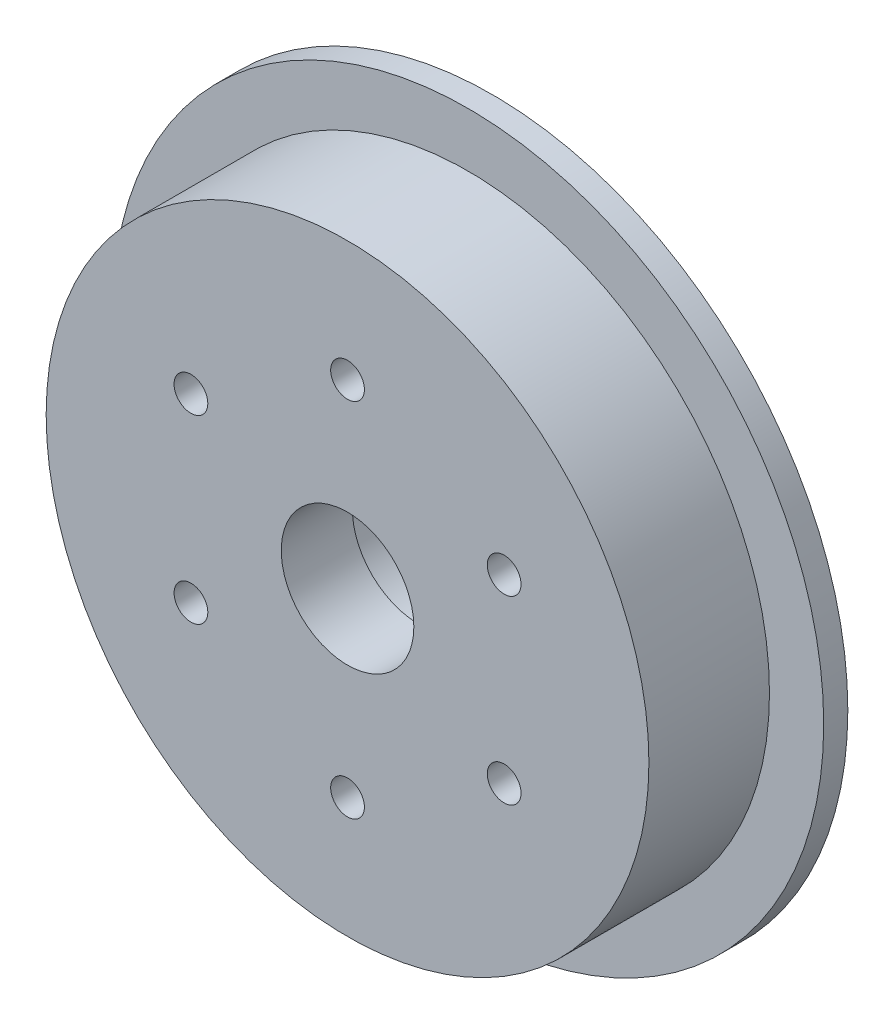
ISO-10303-21;
HEADER;
FILE_DESCRIPTION(('STEP AP214'),'2;1');
FILE_NAME('part.step','',(''),(''),'','','');
FILE_SCHEMA(('AUTOMOTIVE_DESIGN { 1 0 10303 214 1 1 1 1 }'));
ENDSEC;
DATA;
#1=APPLICATION_CONTEXT('core data for automotive mechanical design processes');
#2=APPLICATION_PROTOCOL_DEFINITION('international standard','automotive_design',2000,#1);
#3=PRODUCT_CONTEXT('',#1,'mechanical');
#4=PRODUCT('Part','Part','',(#3));
#5=PRODUCT_RELATED_PRODUCT_CATEGORY('part','',(#4));
#6=PRODUCT_DEFINITION_FORMATION('','',#4);
#7=PRODUCT_DEFINITION_CONTEXT('part definition',#1,'design');
#8=PRODUCT_DEFINITION('design','',#6,#7);
#9=PRODUCT_DEFINITION_SHAPE('','',#8);
#10=(LENGTH_UNIT() NAMED_UNIT(*) SI_UNIT(.MILLI.,.METRE.));
#11=(NAMED_UNIT(*) PLANE_ANGLE_UNIT() SI_UNIT($,.RADIAN.));
#12=(NAMED_UNIT(*) SI_UNIT($,.STERADIAN.) SOLID_ANGLE_UNIT());
#13=UNCERTAINTY_MEASURE_WITH_UNIT(LENGTH_MEASURE(1.E-05),#10,'distance_accuracy_value','');
#14=(GEOMETRIC_REPRESENTATION_CONTEXT(3) GLOBAL_UNCERTAINTY_ASSIGNED_CONTEXT((#13)) GLOBAL_UNIT_ASSIGNED_CONTEXT((#10,
#11,#12)) REPRESENTATION_CONTEXT('',''));
#15=CARTESIAN_POINT('',(0.,0.,0.));
#16=DIRECTION('',(0.,0.,1.));
#17=DIRECTION('',(1.,0.,0.));
#18=AXIS2_PLACEMENT_3D('',#15,#16,#17);
#19=CARTESIAN_POINT('',(0.,0.,12.001));
#20=DIRECTION('',(0.,0.,-1.));
#21=DIRECTION('',(-1.,0.,0.));
#22=AXIS2_PLACEMENT_3D('',#19,#20,#21);
#23=CYLINDRICAL_SURFACE('',#22,6.5);
#24=CARTESIAN_POINT('',(0.,0.,0.));
#25=DIRECTION('',(0.,0.,-1.));
#26=DIRECTION('',(-1.,0.,0.));
#27=AXIS2_PLACEMENT_3D('',#24,#25,#26);
#28=CIRCLE('',#27,6.5);
#29=CARTESIAN_POINT('',(-6.5,0.,0.));
#30=VERTEX_POINT('',#29);
#31=EDGE_CURVE('E69',#30,#30,#28,.T.);
#32=ORIENTED_EDGE('',*,*,#31,.T.);
#33=EDGE_LOOP('',(#32));
#34=FACE_BOUND('',#33,.T.);
#35=CARTESIAN_POINT('',(0.,0.,6.1));
#36=DIRECTION('',(0.,0.,1.));
#37=DIRECTION('',(1.,0.,0.));
#38=AXIS2_PLACEMENT_3D('',#35,#36,#37);
#39=CIRCLE('',#38,6.5);
#40=CARTESIAN_POINT('',(6.5,0.,6.1));
#41=VERTEX_POINT('',#40);
#42=EDGE_CURVE('E10',#41,#41,#39,.F.);
#43=ORIENTED_EDGE('',*,*,#42,.F.);
#44=EDGE_LOOP('',(#43));
#45=FACE_BOUND('',#44,.T.);
#46=ADVANCED_FACE('F32',(#34,#45),#23,.F.);
#47=CARTESIAN_POINT('',(0.,0.,2.));
#48=DIRECTION('',(0.,0.,-1.));
#49=DIRECTION('',(-1.,0.,0.));
#50=AXIS2_PLACEMENT_3D('',#47,#48,#49);
#51=CYLINDRICAL_SURFACE('',#50,29.5);
#52=CARTESIAN_POINT('',(0.,0.,2.));
#53=DIRECTION('',(0.,0.,1.));
#54=DIRECTION('',(1.,0.,0.));
#55=AXIS2_PLACEMENT_3D('',#52,#53,#54);
#56=CIRCLE('',#55,29.5);
#57=CARTESIAN_POINT('',(29.5,0.,2.));
#58=VERTEX_POINT('',#57);
#59=EDGE_CURVE('E43',#58,#58,#56,.T.);
#60=ORIENTED_EDGE('',*,*,#59,.F.);
#61=EDGE_LOOP('',(#60));
#62=FACE_BOUND('',#61,.T.);
#63=CARTESIAN_POINT('',(0.,0.,0.));
#64=DIRECTION('',(0.,0.,1.));
#65=DIRECTION('',(1.,0.,0.));
#66=AXIS2_PLACEMENT_3D('',#63,#64,#65);
#67=CIRCLE('',#66,29.5);
#68=CARTESIAN_POINT('',(29.5,0.,0.));
#69=VERTEX_POINT('',#68);
#70=EDGE_CURVE('E48',#69,#69,#67,.T.);
#71=ORIENTED_EDGE('',*,*,#70,.T.);
#72=EDGE_LOOP('',(#71));
#73=FACE_BOUND('',#72,.T.);
#74=ADVANCED_FACE('F34',(#62,#73),#51,.T.);
#75=CARTESIAN_POINT('',(0.,0.,2.));
#76=DIRECTION('',(0.,0.,1.));
#77=DIRECTION('',(1.,0.,0.));
#78=AXIS2_PLACEMENT_3D('',#75,#76,#77);
#79=PLANE('',#78);
#80=CARTESIAN_POINT('',(0.,0.,2.));
#81=DIRECTION('',(0.,0.,1.));
#82=DIRECTION('',(1.,0.,0.));
#83=AXIS2_PLACEMENT_3D('',#80,#81,#82);
#84=CIRCLE('',#83,25.);
#85=CARTESIAN_POINT('',(25.,0.,2.));
#86=VERTEX_POINT('',#85);
#87=EDGE_CURVE('E39',#86,#86,#84,.T.);
#88=ORIENTED_EDGE('',*,*,#87,.F.);
#89=EDGE_LOOP('',(#88));
#90=FACE_BOUND('',#89,.T.);
#91=ORIENTED_EDGE('',*,*,#59,.T.);
#92=EDGE_LOOP('',(#91));
#93=FACE_BOUND('',#92,.T.);
#94=ADVANCED_FACE('F138',(#90,#93),#79,.T.);
#95=CARTESIAN_POINT('',(0.,0.,0.));
#96=DIRECTION('',(0.,0.,1.));
#97=DIRECTION('',(1.,0.,0.));
#98=AXIS2_PLACEMENT_3D('',#95,#96,#97);
#99=PLANE('',#98);
#100=ORIENTED_EDGE('',*,*,#31,.F.);
#101=EDGE_LOOP('',(#100));
#102=FACE_BOUND('',#101,.T.);
#103=CARTESIAN_POINT('',(1.15185734530882E-12,-15.0000000000007,0.));
#104=DIRECTION('',(0.,0.,1.));
#105=DIRECTION('',(1.,0.,0.));
#106=AXIS2_PLACEMENT_3D('',#103,#104,#105);
#107=CIRCLE('',#106,1.4);
#108=CARTESIAN_POINT('',(1.40000000000115,-15.0000000000007,0.));
#109=VERTEX_POINT('',#108);
#110=EDGE_CURVE('E57',#109,#109,#107,.T.);
#111=ORIENTED_EDGE('',*,*,#110,.T.);
#112=EDGE_LOOP('',(#111));
#113=FACE_BOUND('',#112,.T.);
#114=CARTESIAN_POINT('',(-12.9903810567658,-7.50000000000133,0.));
#115=DIRECTION('',(0.,0.,1.));
#116=DIRECTION('',(1.,0.,0.));
#117=AXIS2_PLACEMENT_3D('',#114,#115,#116);
#118=CIRCLE('',#117,1.4);
#119=CARTESIAN_POINT('',(-11.5903810567658,-7.50000000000133,0.));
#120=VERTEX_POINT('',#119);
#121=EDGE_CURVE('E66',#120,#120,#118,.T.);
#122=ORIENTED_EDGE('',*,*,#121,.T.);
#123=EDGE_LOOP('',(#122));
#124=FACE_BOUND('',#123,.T.);
#125=CARTESIAN_POINT('',(-12.9903810567666,7.49999999999867,0.));
#126=DIRECTION('',(0.,0.,1.));
#127=DIRECTION('',(1.,0.,0.));
#128=AXIS2_PLACEMENT_3D('',#125,#126,#127);
#129=CIRCLE('',#128,1.4);
#130=CARTESIAN_POINT('',(-11.5903810567666,7.49999999999867,0.));
#131=VERTEX_POINT('',#130);
#132=EDGE_CURVE('E77',#131,#131,#129,.T.);
#133=ORIENTED_EDGE('',*,*,#132,.T.);
#134=EDGE_LOOP('',(#133));
#135=FACE_BOUND('',#134,.T.);
#136=CARTESIAN_POINT('',(12.9903810567673,-7.49999999999998,0.));
#137=DIRECTION('',(0.,0.,1.));
#138=DIRECTION('',(1.,0.,0.));
#139=AXIS2_PLACEMENT_3D('',#136,#137,#138);
#140=CIRCLE('',#139,1.4);
#141=CARTESIAN_POINT('',(14.3903810567673,-7.49999999999998,0.));
#142=VERTEX_POINT('',#141);
#143=EDGE_CURVE('E83',#142,#142,#140,.T.);
#144=ORIENTED_EDGE('',*,*,#143,.T.);
#145=EDGE_LOOP('',(#144));
#146=FACE_BOUND('',#145,.T.);
#147=CARTESIAN_POINT('',(12.9903810567666,7.50000000000002,0.));
#148=DIRECTION('',(0.,0.,1.));
#149=DIRECTION('',(1.,0.,0.));
#150=AXIS2_PLACEMENT_3D('',#147,#148,#149);
#151=CIRCLE('',#150,1.4);
#152=CARTESIAN_POINT('',(14.3903810567666,7.50000000000002,0.));
#153=VERTEX_POINT('',#152);
#154=EDGE_CURVE('E89',#153,#153,#151,.T.);
#155=ORIENTED_EDGE('',*,*,#154,.T.);
#156=EDGE_LOOP('',(#155));
#157=FACE_BOUND('',#156,.T.);
#158=CARTESIAN_POINT('',(-4.11130421066727E-13,14.9999999999993,0.));
#159=DIRECTION('',(0.,0.,1.));
#160=DIRECTION('',(1.,0.,0.));
#161=AXIS2_PLACEMENT_3D('',#158,#159,#160);
#162=CIRCLE('',#161,1.4);
#163=CARTESIAN_POINT('',(1.39999999999959,14.9999999999993,0.));
#164=VERTEX_POINT('',#163);
#165=EDGE_CURVE('E95',#164,#164,#162,.T.);
#166=ORIENTED_EDGE('',*,*,#165,.T.);
#167=EDGE_LOOP('',(#166));
#168=FACE_BOUND('',#167,.T.);
#169=ORIENTED_EDGE('',*,*,#70,.F.);
#170=EDGE_LOOP('',(#169));
#171=FACE_BOUND('',#170,.T.);
#172=ADVANCED_FACE('F128',(#102,#113,#124,#135,#146,#157,#168,#171),#99,.F.);
#173=CARTESIAN_POINT('',(0.,0.,12.));
#174=DIRECTION('',(0.,0.,-1.));
#175=DIRECTION('',(-1.,0.,0.));
#176=AXIS2_PLACEMENT_3D('',#173,#174,#175);
#177=CYLINDRICAL_SURFACE('',#176,25.);
#178=CARTESIAN_POINT('',(0.,0.,12.));
#179=DIRECTION('',(0.,0.,1.));
#180=DIRECTION('',(1.,0.,0.));
#181=AXIS2_PLACEMENT_3D('',#178,#179,#180);
#182=CIRCLE('',#181,25.);
#183=CARTESIAN_POINT('',(25.,0.,12.));
#184=VERTEX_POINT('',#183);
#185=EDGE_CURVE('E51',#184,#184,#182,.T.);
#186=ORIENTED_EDGE('',*,*,#185,.F.);
#187=EDGE_LOOP('',(#186));
#188=FACE_BOUND('',#187,.T.);
#189=ORIENTED_EDGE('',*,*,#87,.T.);
#190=EDGE_LOOP('',(#189));
#191=FACE_BOUND('',#190,.T.);
#192=ADVANCED_FACE('F118',(#188,#191),#177,.T.);
#193=CARTESIAN_POINT('',(0.,0.,12.));
#194=DIRECTION('',(0.,0.,1.));
#195=DIRECTION('',(1.,0.,0.));
#196=AXIS2_PLACEMENT_3D('',#193,#194,#195);
#197=PLANE('',#196);
#198=CARTESIAN_POINT('',(1.15185734530882E-12,-15.0000000000007,12.));
#199=DIRECTION('',(0.,0.,1.));
#200=DIRECTION('',(1.,0.,0.));
#201=AXIS2_PLACEMENT_3D('',#198,#199,#200);
#202=CIRCLE('',#201,1.4);
#203=CARTESIAN_POINT('',(1.40000000000115,-15.0000000000007,12.));
#204=VERTEX_POINT('',#203);
#205=EDGE_CURVE('E61',#204,#204,#202,.T.);
#206=ORIENTED_EDGE('',*,*,#205,.F.);
#207=EDGE_LOOP('',(#206));
#208=FACE_BOUND('',#207,.T.);
#209=CARTESIAN_POINT('',(-12.9903810567658,-7.50000000000133,12.));
#210=DIRECTION('',(0.,0.,1.));
#211=DIRECTION('',(1.,0.,0.));
#212=AXIS2_PLACEMENT_3D('',#209,#210,#211);
#213=CIRCLE('',#212,1.4);
#214=CARTESIAN_POINT('',(-11.5903810567658,-7.50000000000133,12.));
#215=VERTEX_POINT('',#214);
#216=EDGE_CURVE('E74',#215,#215,#213,.T.);
#217=ORIENTED_EDGE('',*,*,#216,.F.);
#218=EDGE_LOOP('',(#217));
#219=FACE_BOUND('',#218,.T.);
#220=CARTESIAN_POINT('',(-12.9903810567666,7.49999999999867,12.));
#221=DIRECTION('',(0.,0.,1.));
#222=DIRECTION('',(1.,0.,0.));
#223=AXIS2_PLACEMENT_3D('',#220,#221,#222);
#224=CIRCLE('',#223,1.4);
#225=CARTESIAN_POINT('',(-11.5903810567666,7.49999999999867,12.));
#226=VERTEX_POINT('',#225);
#227=EDGE_CURVE('E80',#226,#226,#224,.T.);
#228=ORIENTED_EDGE('',*,*,#227,.F.);
#229=EDGE_LOOP('',(#228));
#230=FACE_BOUND('',#229,.T.);
#231=CARTESIAN_POINT('',(12.9903810567673,-7.49999999999998,12.));
#232=DIRECTION('',(0.,0.,1.));
#233=DIRECTION('',(1.,0.,0.));
#234=AXIS2_PLACEMENT_3D('',#231,#232,#233);
#235=CIRCLE('',#234,1.4);
#236=CARTESIAN_POINT('',(14.3903810567673,-7.49999999999998,12.));
#237=VERTEX_POINT('',#236);
#238=EDGE_CURVE('E86',#237,#237,#235,.T.);
#239=ORIENTED_EDGE('',*,*,#238,.F.);
#240=EDGE_LOOP('',(#239));
#241=FACE_BOUND('',#240,.T.);
#242=CARTESIAN_POINT('',(12.9903810567666,7.50000000000002,12.));
#243=DIRECTION('',(0.,0.,1.));
#244=DIRECTION('',(1.,0.,0.));
#245=AXIS2_PLACEMENT_3D('',#242,#243,#244);
#246=CIRCLE('',#245,1.4);
#247=CARTESIAN_POINT('',(14.3903810567666,7.50000000000002,12.));
#248=VERTEX_POINT('',#247);
#249=EDGE_CURVE('E92',#248,#248,#246,.T.);
#250=ORIENTED_EDGE('',*,*,#249,.F.);
#251=EDGE_LOOP('',(#250));
#252=FACE_BOUND('',#251,.T.);
#253=CARTESIAN_POINT('',(-4.11130421066727E-13,14.9999999999993,12.));
#254=DIRECTION('',(0.,0.,1.));
#255=DIRECTION('',(1.,0.,0.));
#256=AXIS2_PLACEMENT_3D('',#253,#254,#255);
#257=CIRCLE('',#256,1.4);
#258=CARTESIAN_POINT('',(1.39999999999959,14.9999999999993,12.));
#259=VERTEX_POINT('',#258);
#260=EDGE_CURVE('E97',#259,#259,#257,.T.);
#261=ORIENTED_EDGE('',*,*,#260,.F.);
#262=EDGE_LOOP('',(#261));
#263=FACE_BOUND('',#262,.T.);
#264=ORIENTED_EDGE('',*,*,#185,.T.);
#265=EDGE_LOOP('',(#264));
#266=FACE_BOUND('',#265,.T.);
#267=CARTESIAN_POINT('',(0.,0.,12.));
#268=DIRECTION('',(0.,0.,1.));
#269=DIRECTION('',(1.,0.,0.));
#270=AXIS2_PLACEMENT_3D('',#267,#268,#269);
#271=CIRCLE('',#270,5.5);
#272=CARTESIAN_POINT('',(5.5,0.,12.));
#273=VERTEX_POINT('',#272);
#274=EDGE_CURVE('E106',#273,#273,#271,.T.);
#275=ORIENTED_EDGE('',*,*,#274,.F.);
#276=EDGE_LOOP('',(#275));
#277=FACE_BOUND('',#276,.T.);
#278=ADVANCED_FACE('F115',(#208,#219,#230,#241,#252,#263,#266,#277),#197,.T.);
#279=CARTESIAN_POINT('',(-4.11130421066727E-13,14.9999999999993,0.));
#280=DIRECTION('',(0.,0.,1.));
#281=DIRECTION('',(1.,0.,0.));
#282=AXIS2_PLACEMENT_3D('',#279,#280,#281);
#283=CYLINDRICAL_SURFACE('',#282,1.4);
#284=ORIENTED_EDGE('',*,*,#165,.F.);
#285=EDGE_LOOP('',(#284));
#286=FACE_BOUND('',#285,.T.);
#287=ORIENTED_EDGE('',*,*,#260,.T.);
#288=EDGE_LOOP('',(#287));
#289=FACE_BOUND('',#288,.T.);
#290=ADVANCED_FACE('F117',(#286,#289),#283,.F.);
#291=CARTESIAN_POINT('',(12.9903810567666,7.50000000000002,0.));
#292=DIRECTION('',(0.,0.,1.));
#293=DIRECTION('',(1.,0.,0.));
#294=AXIS2_PLACEMENT_3D('',#291,#292,#293);
#295=CYLINDRICAL_SURFACE('',#294,1.4);
#296=ORIENTED_EDGE('',*,*,#154,.F.);
#297=EDGE_LOOP('',(#296));
#298=FACE_BOUND('',#297,.T.);
#299=ORIENTED_EDGE('',*,*,#249,.T.);
#300=EDGE_LOOP('',(#299));
#301=FACE_BOUND('',#300,.T.);
#302=ADVANCED_FACE('F125',(#298,#301),#295,.F.);
#303=CARTESIAN_POINT('',(12.9903810567673,-7.49999999999998,0.));
#304=DIRECTION('',(0.,0.,1.));
#305=DIRECTION('',(1.,0.,0.));
#306=AXIS2_PLACEMENT_3D('',#303,#304,#305);
#307=CYLINDRICAL_SURFACE('',#306,1.4);
#308=ORIENTED_EDGE('',*,*,#143,.F.);
#309=EDGE_LOOP('',(#308));
#310=FACE_BOUND('',#309,.T.);
#311=ORIENTED_EDGE('',*,*,#238,.T.);
#312=EDGE_LOOP('',(#311));
#313=FACE_BOUND('',#312,.T.);
#314=ADVANCED_FACE('F156',(#310,#313),#307,.F.);
#315=CARTESIAN_POINT('',(-12.9903810567666,7.49999999999867,0.));
#316=DIRECTION('',(0.,0.,1.));
#317=DIRECTION('',(1.,0.,0.));
#318=AXIS2_PLACEMENT_3D('',#315,#316,#317);
#319=CYLINDRICAL_SURFACE('',#318,1.4);
#320=ORIENTED_EDGE('',*,*,#132,.F.);
#321=EDGE_LOOP('',(#320));
#322=FACE_BOUND('',#321,.T.);
#323=ORIENTED_EDGE('',*,*,#227,.T.);
#324=EDGE_LOOP('',(#323));
#325=FACE_BOUND('',#324,.T.);
#326=ADVANCED_FACE('F152',(#322,#325),#319,.F.);
#327=CARTESIAN_POINT('',(-12.9903810567658,-7.50000000000133,0.));
#328=DIRECTION('',(0.,0.,1.));
#329=DIRECTION('',(1.,0.,0.));
#330=AXIS2_PLACEMENT_3D('',#327,#328,#329);
#331=CYLINDRICAL_SURFACE('',#330,1.4);
#332=ORIENTED_EDGE('',*,*,#121,.F.);
#333=EDGE_LOOP('',(#332));
#334=FACE_BOUND('',#333,.T.);
#335=ORIENTED_EDGE('',*,*,#216,.T.);
#336=EDGE_LOOP('',(#335));
#337=FACE_BOUND('',#336,.T.);
#338=ADVANCED_FACE('F148',(#334,#337),#331,.F.);
#339=CARTESIAN_POINT('',(1.15185734530882E-12,-15.0000000000007,0.));
#340=DIRECTION('',(0.,0.,1.));
#341=DIRECTION('',(1.,0.,0.));
#342=AXIS2_PLACEMENT_3D('',#339,#340,#341);
#343=CYLINDRICAL_SURFACE('',#342,1.4);
#344=ORIENTED_EDGE('',*,*,#110,.F.);
#345=EDGE_LOOP('',(#344));
#346=FACE_BOUND('',#345,.T.);
#347=ORIENTED_EDGE('',*,*,#205,.T.);
#348=EDGE_LOOP('',(#347));
#349=FACE_BOUND('',#348,.T.);
#350=ADVANCED_FACE('F145',(#346,#349),#343,.F.);
#351=CARTESIAN_POINT('',(0.,0.,6.1));
#352=DIRECTION('',(0.,0.,1.));
#353=DIRECTION('',(1.,0.,0.));
#354=AXIS2_PLACEMENT_3D('',#351,#352,#353);
#355=PLANE('',#354);
#356=CARTESIAN_POINT('',(0.,0.,6.1));
#357=DIRECTION('',(0.,0.,1.));
#358=DIRECTION('',(1.,0.,0.));
#359=AXIS2_PLACEMENT_3D('',#356,#357,#358);
#360=CIRCLE('',#359,5.5);
#361=CARTESIAN_POINT('',(5.5,0.,6.1));
#362=VERTEX_POINT('',#361);
#363=EDGE_CURVE('E102',#362,#362,#360,.T.);
#364=ORIENTED_EDGE('',*,*,#363,.T.);
#365=EDGE_LOOP('',(#364));
#366=FACE_BOUND('',#365,.T.);
#367=ORIENTED_EDGE('',*,*,#42,.T.);
#368=EDGE_LOOP('',(#367));
#369=FACE_BOUND('',#368,.T.);
#370=ADVANCED_FACE('F143',(#366,#369),#355,.F.);
#371=CARTESIAN_POINT('',(0.,0.,6.1));
#372=DIRECTION('',(0.,0.,1.));
#373=DIRECTION('',(1.,0.,0.));
#374=AXIS2_PLACEMENT_3D('',#371,#372,#373);
#375=CYLINDRICAL_SURFACE('',#374,5.5);
#376=ORIENTED_EDGE('',*,*,#363,.F.);
#377=EDGE_LOOP('',(#376));
#378=FACE_BOUND('',#377,.T.);
#379=ORIENTED_EDGE('',*,*,#274,.T.);
#380=EDGE_LOOP('',(#379));
#381=FACE_BOUND('',#380,.T.);
#382=ADVANCED_FACE('F113',(#378,#381),#375,.F.);
#383=CLOSED_SHELL('',(#46,#74,#94,#172,#192,#278,#290,#302,#314,#326,#338,#350,#370,#382));
#384=MANIFOLD_SOLID_BREP('B2',#383);
#385=ADVANCED_BREP_SHAPE_REPRESENTATION('',(#18,#384),#14);
#386=SHAPE_DEFINITION_REPRESENTATION(#9,#385);
ENDSEC;
END-ISO-10303-21;
